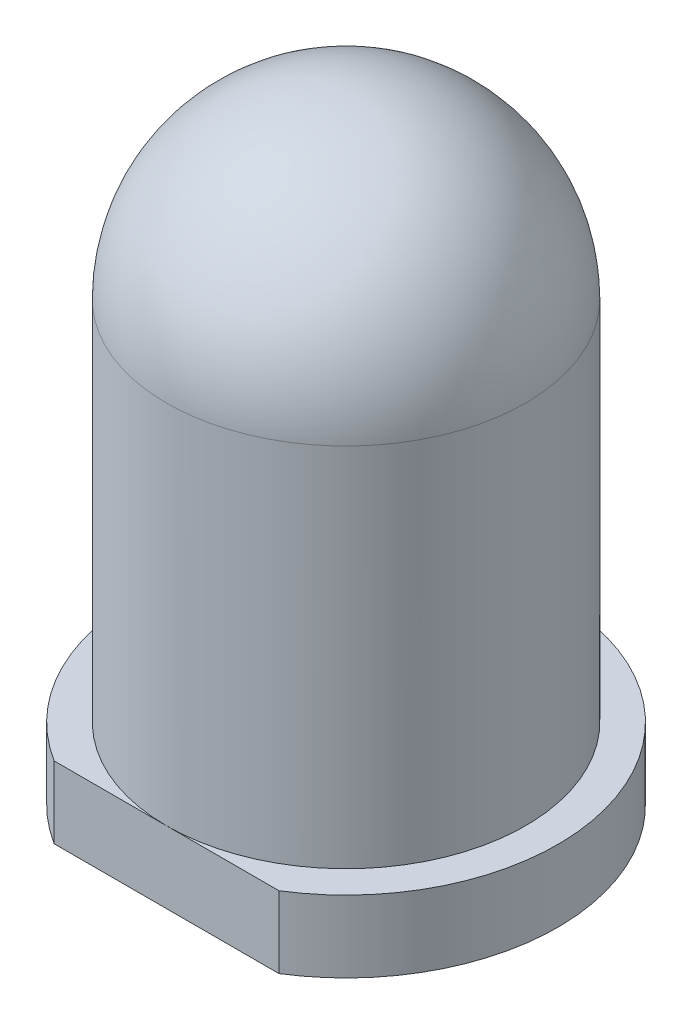
ISO-10303-21;
HEADER;
FILE_DESCRIPTION(('STEP AP214'),'2;1');
FILE_NAME('part.step','',(''),(''),'','','');
FILE_SCHEMA(('AUTOMOTIVE_DESIGN { 1 0 10303 214 1 1 1 1 }'));
ENDSEC;
DATA;
#1=APPLICATION_CONTEXT('core data for automotive mechanical design processes');
#2=APPLICATION_PROTOCOL_DEFINITION('international standard','automotive_design',2000,#1);
#3=PRODUCT_CONTEXT('',#1,'mechanical');
#4=PRODUCT('Part','Part','',(#3));
#5=PRODUCT_RELATED_PRODUCT_CATEGORY('part','',(#4));
#6=PRODUCT_DEFINITION_FORMATION('','',#4);
#7=PRODUCT_DEFINITION_CONTEXT('part definition',#1,'design');
#8=PRODUCT_DEFINITION('design','',#6,#7);
#9=PRODUCT_DEFINITION_SHAPE('','',#8);
#10=(LENGTH_UNIT() NAMED_UNIT(*) SI_UNIT(.MILLI.,.METRE.));
#11=(NAMED_UNIT(*) PLANE_ANGLE_UNIT() SI_UNIT($,.RADIAN.));
#12=(NAMED_UNIT(*) SI_UNIT($,.STERADIAN.) SOLID_ANGLE_UNIT());
#13=UNCERTAINTY_MEASURE_WITH_UNIT(LENGTH_MEASURE(1.E-05),#10,'distance_accuracy_value','');
#14=(GEOMETRIC_REPRESENTATION_CONTEXT(3) GLOBAL_UNCERTAINTY_ASSIGNED_CONTEXT((#13)) GLOBAL_UNIT_ASSIGNED_CONTEXT((#10,
#11,#12)) REPRESENTATION_CONTEXT('',''));
#15=CARTESIAN_POINT('',(0.,0.,0.));
#16=DIRECTION('',(0.,0.,1.));
#17=DIRECTION('',(1.,0.,0.));
#18=AXIS2_PLACEMENT_3D('',#15,#16,#17);
#19=CARTESIAN_POINT('',(0.,8.6,0.));
#20=DIRECTION('',(0.,-1.,0.));
#21=DIRECTION('',(0.,0.,-1.));
#22=AXIS2_PLACEMENT_3D('',#19,#20,#21);
#23=CYLINDRICAL_SURFACE('',#22,2.5);
#24=CARTESIAN_POINT('',(0.,1.,0.));
#25=DIRECTION('',(0.,1.,0.));
#26=DIRECTION('',(0.,0.,1.));
#27=AXIS2_PLACEMENT_3D('',#24,#25,#26);
#28=CIRCLE('',#27,2.5);
#29=CARTESIAN_POINT('',(0.,1.,2.5));
#30=VERTEX_POINT('',#29);
#31=EDGE_CURVE('E11',#30,#30,#28,.T.);
#32=ORIENTED_EDGE('',*,*,#31,.T.);
#33=EDGE_LOOP('',(#32));
#34=FACE_BOUND('',#33,.T.);
#35=CARTESIAN_POINT('',(0.,6.1,0.));
#36=DIRECTION('',(0.,-1.,0.));
#37=DIRECTION('',(0.,0.,-1.));
#38=AXIS2_PLACEMENT_3D('',#35,#36,#37);
#39=CIRCLE('',#38,2.5);
#40=CARTESIAN_POINT('',(0.,6.1,-2.5));
#41=VERTEX_POINT('',#40);
#42=EDGE_CURVE('E41',#41,#41,#39,.T.);
#43=ORIENTED_EDGE('',*,*,#42,.T.);
#44=EDGE_LOOP('',(#43));
#45=FACE_BOUND('',#44,.T.);
#46=ADVANCED_FACE('F33',(#34,#45),#23,.T.);
#47=CARTESIAN_POINT('',(0.,6.1,0.));
#48=DIRECTION('',(0.,0.,1.));
#49=DIRECTION('',(1.,0.,0.));
#50=AXIS2_PLACEMENT_3D('',#47,#48,#49);
#51=SPHERICAL_SURFACE('',#50,2.5);
#52=CARTESIAN_POINT('',(0.,6.1,0.));
#53=DIRECTION('',(0.,-1.,0.));
#54=DIRECTION('',(0.,0.,-1.));
#55=AXIS2_PLACEMENT_3D('',#52,#53,#54);
#56=SPHERICAL_SURFACE('',#55,2.5);
#57=ORIENTED_EDGE('',*,*,#42,.F.);
#58=EDGE_LOOP('',(#57));
#59=FACE_BOUND('',#58,.T.);
#60=ADVANCED_FACE('F35',(#59),#56,.T.);
#61=CARTESIAN_POINT('',(0.,1.,0.));
#62=DIRECTION('',(0.,1.,0.));
#63=DIRECTION('',(0.,0.,1.));
#64=AXIS2_PLACEMENT_3D('',#61,#62,#63);
#65=PLANE('',#64);
#66=DIRECTION('',(1.,0.,0.));
#67=VECTOR('',#66,1.);
#68=CARTESIAN_POINT('',(1.56604597633658,1.,2.5));
#69=LINE('',#68,#67);
#70=CARTESIAN_POINT('',(-1.56604597633658,1.,2.5));
#71=VERTEX_POINT('',#70);
#72=EDGE_CURVE('E48',#71,#30,#69,.T.);
#73=ORIENTED_EDGE('',*,*,#72,.T.);
#74=ORIENTED_EDGE('',*,*,#31,.F.);
#75=CARTESIAN_POINT('',(1.56604597633658,1.,2.5));
#76=VERTEX_POINT('',#75);
#77=EDGE_CURVE('E53',#30,#76,#69,.T.);
#78=ORIENTED_EDGE('',*,*,#77,.T.);
#79=CARTESIAN_POINT('',(0.,1.,0.));
#80=DIRECTION('',(0.,1.,0.));
#81=DIRECTION('',(0.,0.,1.));
#82=AXIS2_PLACEMENT_3D('',#79,#80,#81);
#83=CIRCLE('',#82,2.95);
#84=EDGE_CURVE('E73',#76,#71,#83,.T.);
#85=ORIENTED_EDGE('',*,*,#84,.T.);
#86=EDGE_LOOP('',(#73,#74,#78,#85));
#87=FACE_BOUND('',#86,.T.);
#88=ADVANCED_FACE('F89',(#87),#65,.T.);
#89=CARTESIAN_POINT('',(1.56604597633658,1.,2.5));
#90=DIRECTION('',(0.,0.,-1.));
#91=DIRECTION('',(-1.,0.,0.));
#92=AXIS2_PLACEMENT_3D('',#89,#90,#91);
#93=PLANE('',#92);
#94=ORIENTED_EDGE('',*,*,#77,.F.);
#95=ORIENTED_EDGE('',*,*,#72,.F.);
#96=DIRECTION('',(0.,-1.,0.));
#97=VECTOR('',#96,1.);
#98=CARTESIAN_POINT('',(-1.56604597633658,1.,2.5));
#99=LINE('',#98,#97);
#100=CARTESIAN_POINT('',(-1.56604597633658,0.,2.5));
#101=VERTEX_POINT('',#100);
#102=EDGE_CURVE('E69',#71,#101,#99,.T.);
#103=ORIENTED_EDGE('',*,*,#102,.T.);
#104=DIRECTION('',(1.,0.,0.));
#105=VECTOR('',#104,1.);
#106=CARTESIAN_POINT('',(1.56604597633658,0.,2.5));
#107=LINE('',#106,#105);
#108=CARTESIAN_POINT('',(1.56604597633658,0.,2.5));
#109=VERTEX_POINT('',#108);
#110=EDGE_CURVE('E63',#101,#109,#107,.T.);
#111=ORIENTED_EDGE('',*,*,#110,.T.);
#112=DIRECTION('',(0.,-1.,0.));
#113=VECTOR('',#112,1.);
#114=CARTESIAN_POINT('',(1.56604597633658,1.,2.5));
#115=LINE('',#114,#113);
#116=EDGE_CURVE('E66',#76,#109,#115,.T.);
#117=ORIENTED_EDGE('',*,*,#116,.F.);
#118=EDGE_LOOP('',(#94,#95,#103,#111,#117));
#119=FACE_BOUND('',#118,.T.);
#120=ADVANCED_FACE('F65',(#119),#93,.F.);
#121=CARTESIAN_POINT('',(0.,1.,0.));
#122=DIRECTION('',(0.,-1.,0.));
#123=DIRECTION('',(0.,0.,-1.));
#124=AXIS2_PLACEMENT_3D('',#121,#122,#123);
#125=CYLINDRICAL_SURFACE('',#124,2.95);
#126=CARTESIAN_POINT('',(0.,0.,0.));
#127=DIRECTION('',(0.,1.,0.));
#128=DIRECTION('',(0.,0.,1.));
#129=AXIS2_PLACEMENT_3D('',#126,#127,#128);
#130=CIRCLE('',#129,2.95);
#131=EDGE_CURVE('E74',#109,#101,#130,.T.);
#132=ORIENTED_EDGE('',*,*,#131,.T.);
#133=ORIENTED_EDGE('',*,*,#102,.F.);
#134=ORIENTED_EDGE('',*,*,#84,.F.);
#135=ORIENTED_EDGE('',*,*,#116,.T.);
#136=EDGE_LOOP('',(#132,#133,#134,#135));
#137=FACE_BOUND('',#136,.T.);
#138=ADVANCED_FACE('F77',(#137),#125,.T.);
#139=CARTESIAN_POINT('',(0.,0.,0.));
#140=DIRECTION('',(0.,1.,0.));
#141=DIRECTION('',(0.,0.,1.));
#142=AXIS2_PLACEMENT_3D('',#139,#140,#141);
#143=PLANE('',#142);
#144=ORIENTED_EDGE('',*,*,#110,.F.);
#145=ORIENTED_EDGE('',*,*,#131,.F.);
#146=EDGE_LOOP('',(#144,#145));
#147=FACE_BOUND('',#146,.T.);
#148=ADVANCED_FACE('F79',(#147),#143,.F.);
#149=CLOSED_SHELL('',(#46,#60,#88,#120,#138,#148));
#150=MANIFOLD_SOLID_BREP('B2',#149);
#151=ADVANCED_BREP_SHAPE_REPRESENTATION('',(#18,#150),#14);
#152=SHAPE_DEFINITION_REPRESENTATION(#9,#151);
ENDSEC;
END-ISO-10303-21;
